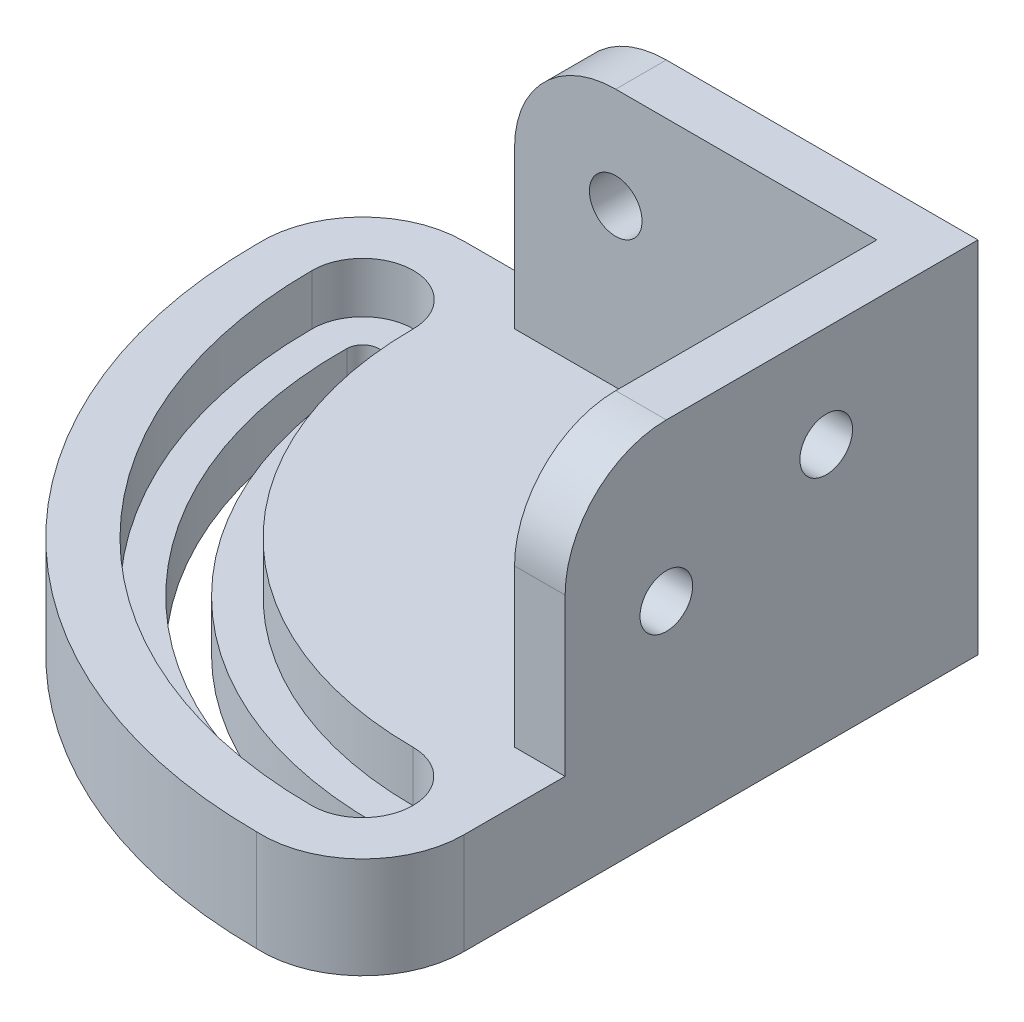
ISO-10303-21;
HEADER;
FILE_DESCRIPTION(('STEP AP214'),'2;1');
FILE_NAME('part.step','',(''),(''),'','','');
FILE_SCHEMA(('AUTOMOTIVE_DESIGN { 1 0 10303 214 1 1 1 1 }'));
ENDSEC;
DATA;
#1=APPLICATION_CONTEXT('core data for automotive mechanical design processes');
#2=APPLICATION_PROTOCOL_DEFINITION('international standard','automotive_design',2000,#1);
#3=PRODUCT_CONTEXT('',#1,'mechanical');
#4=PRODUCT('Part','Part','',(#3));
#5=PRODUCT_RELATED_PRODUCT_CATEGORY('part','',(#4));
#6=PRODUCT_DEFINITION_FORMATION('','',#4);
#7=PRODUCT_DEFINITION_CONTEXT('part definition',#1,'design');
#8=PRODUCT_DEFINITION('design','',#6,#7);
#9=PRODUCT_DEFINITION_SHAPE('','',#8);
#10=(LENGTH_UNIT() NAMED_UNIT(*) SI_UNIT(.MILLI.,.METRE.));
#11=(NAMED_UNIT(*) PLANE_ANGLE_UNIT() SI_UNIT($,.RADIAN.));
#12=(NAMED_UNIT(*) SI_UNIT($,.STERADIAN.) SOLID_ANGLE_UNIT());
#13=UNCERTAINTY_MEASURE_WITH_UNIT(LENGTH_MEASURE(1.E-05),#10,'distance_accuracy_value','');
#14=(GEOMETRIC_REPRESENTATION_CONTEXT(3) GLOBAL_UNCERTAINTY_ASSIGNED_CONTEXT((#13)) GLOBAL_UNIT_ASSIGNED_CONTEXT((#10,
#11,#12)) REPRESENTATION_CONTEXT('',''));
#15=CARTESIAN_POINT('',(0.,0.,0.));
#16=DIRECTION('',(0.,0.,1.));
#17=DIRECTION('',(1.,0.,0.));
#18=AXIS2_PLACEMENT_3D('',#15,#16,#17);
#19=CARTESIAN_POINT('',(-25.4,10.,-15.4));
#20=DIRECTION('',(0.,-1.,0.));
#21=DIRECTION('',(0.,0.,-1.));
#22=AXIS2_PLACEMENT_3D('',#19,#20,#21);
#23=CYLINDRICAL_SURFACE('',#22,1.6);
#24=DIRECTION('',(0.,-1.,0.));
#25=VECTOR('',#24,1.);
#26=CARTESIAN_POINT('',(-23.8001320190187,10.,-15.3794465713147));
#27=LINE('',#26,#25);
#28=CARTESIAN_POINT('',(-23.8001320190187,5.,-15.3794465713147));
#29=VERTEX_POINT('',#28);
#30=CARTESIAN_POINT('',(-23.8001320190187,0.,-15.3794465713147));
#31=VERTEX_POINT('',#30);
#32=EDGE_CURVE('E353',#29,#31,#27,.T.);
#33=ORIENTED_EDGE('',*,*,#32,.F.);
#34=CARTESIAN_POINT('',(-25.4,5.,-15.4));
#35=DIRECTION('',(0.,1.,0.));
#36=DIRECTION('',(0.,0.,1.));
#37=AXIS2_PLACEMENT_3D('',#34,#35,#36);
#38=CIRCLE('',#37,1.6);
#39=CARTESIAN_POINT('',(-26.9998679809813,5.,-15.4205534286851));
#40=VERTEX_POINT('',#39);
#41=EDGE_CURVE('E333',#29,#40,#38,.T.);
#42=ORIENTED_EDGE('',*,*,#41,.T.);
#43=DIRECTION('',(0.,-1.,0.));
#44=VECTOR('',#43,1.);
#45=CARTESIAN_POINT('',(-26.9998679809813,10.,-15.4205534286851));
#46=LINE('',#45,#44);
#47=CARTESIAN_POINT('',(-26.9998679809813,0.,-15.4205534286851));
#48=VERTEX_POINT('',#47);
#49=EDGE_CURVE('E362',#40,#48,#46,.T.);
#50=ORIENTED_EDGE('',*,*,#49,.T.);
#51=CARTESIAN_POINT('',(-25.4,0.,-15.4));
#52=DIRECTION('',(0.,1.,0.));
#53=DIRECTION('',(0.,0.,1.));
#54=AXIS2_PLACEMENT_3D('',#51,#52,#53);
#55=CIRCLE('',#54,1.6);
#56=EDGE_CURVE('E337',#31,#48,#55,.T.);
#57=ORIENTED_EDGE('',*,*,#56,.F.);
#58=EDGE_LOOP('',(#33,#42,#50,#57));
#59=FACE_BOUND('',#58,.T.);
#60=ADVANCED_FACE('F39',(#59),#23,.F.);
#61=CARTESIAN_POINT('',(14.8824927112459,10.,-14.8824927112459));
#62=DIRECTION('',(0.,-1.,0.));
#63=DIRECTION('',(0.,0.,-1.));
#64=AXIS2_PLACEMENT_3D('',#61,#62,#63);
#65=CYLINDRICAL_SURFACE('',#64,41.8858167699935);
#66=ORIENTED_EDGE('',*,*,#49,.F.);
#67=CARTESIAN_POINT('',(14.8824927112459,5.,-14.8824927112459));
#68=DIRECTION('',(0.,1.,0.));
#69=DIRECTION('',(0.,0.,1.));
#70=AXIS2_PLACEMENT_3D('',#67,#68,#69);
#71=CIRCLE('',#70,41.8858167699935);
#72=CARTESIAN_POINT('',(15.4205534286852,5.,26.9998679809813));
#73=VERTEX_POINT('',#72);
#74=EDGE_CURVE('E329',#40,#73,#71,.T.);
#75=ORIENTED_EDGE('',*,*,#74,.T.);
#76=DIRECTION('',(0.,-1.,0.));
#77=VECTOR('',#76,1.);
#78=CARTESIAN_POINT('',(15.4205534286852,10.,26.9998679809813));
#79=LINE('',#78,#77);
#80=CARTESIAN_POINT('',(15.4205534286852,0.,26.9998679809813));
#81=VERTEX_POINT('',#80);
#82=EDGE_CURVE('E359',#73,#81,#79,.T.);
#83=ORIENTED_EDGE('',*,*,#82,.T.);
#84=CARTESIAN_POINT('',(14.8824927112459,0.,-14.8824927112459));
#85=DIRECTION('',(0.,1.,0.));
#86=DIRECTION('',(0.,0.,1.));
#87=AXIS2_PLACEMENT_3D('',#84,#85,#86);
#88=CIRCLE('',#87,41.8858167699935);
#89=EDGE_CURVE('E341',#48,#81,#88,.T.);
#90=ORIENTED_EDGE('',*,*,#89,.F.);
#91=EDGE_LOOP('',(#66,#75,#83,#90));
#92=FACE_BOUND('',#91,.T.);
#93=ADVANCED_FACE('F464',(#92),#65,.F.);
#94=CARTESIAN_POINT('',(15.4,10.,25.4));
#95=DIRECTION('',(0.,-1.,0.));
#96=DIRECTION('',(0.,0.,-1.));
#97=AXIS2_PLACEMENT_3D('',#94,#95,#96);
#98=CYLINDRICAL_SURFACE('',#97,1.6);
#99=ORIENTED_EDGE('',*,*,#82,.F.);
#100=CARTESIAN_POINT('',(15.4,5.,25.4));
#101=DIRECTION('',(0.,1.,0.));
#102=DIRECTION('',(0.,0.,1.));
#103=AXIS2_PLACEMENT_3D('',#100,#101,#102);
#104=CIRCLE('',#103,1.6);
#105=CARTESIAN_POINT('',(15.3794465713148,5.,23.8001320190187));
#106=VERTEX_POINT('',#105);
#107=EDGE_CURVE('E316',#73,#106,#104,.T.);
#108=ORIENTED_EDGE('',*,*,#107,.T.);
#109=DIRECTION('',(0.,-1.,0.));
#110=VECTOR('',#109,1.);
#111=CARTESIAN_POINT('',(15.3794465713148,10.,23.8001320190187));
#112=LINE('',#111,#110);
#113=CARTESIAN_POINT('',(15.3794465713148,0.,23.8001320190187));
#114=VERTEX_POINT('',#113);
#115=EDGE_CURVE('E356',#106,#114,#112,.T.);
#116=ORIENTED_EDGE('',*,*,#115,.T.);
#117=CARTESIAN_POINT('',(15.4,0.,25.4));
#118=DIRECTION('',(0.,1.,0.));
#119=DIRECTION('',(0.,0.,1.));
#120=AXIS2_PLACEMENT_3D('',#117,#118,#119);
#121=CIRCLE('',#120,1.6);
#122=EDGE_CURVE('E345',#81,#114,#121,.T.);
#123=ORIENTED_EDGE('',*,*,#122,.F.);
#124=EDGE_LOOP('',(#99,#108,#116,#123));
#125=FACE_BOUND('',#124,.T.);
#126=ADVANCED_FACE('F470',(#125),#98,.F.);
#127=CARTESIAN_POINT('',(14.8824927112459,10.,-14.8824927112459));
#128=DIRECTION('',(0.,-1.,0.));
#129=DIRECTION('',(0.,0.,-1.));
#130=AXIS2_PLACEMENT_3D('',#127,#128,#129);
#131=CYLINDRICAL_SURFACE('',#130,38.6858167699935);
#132=ORIENTED_EDGE('',*,*,#115,.F.);
#133=CARTESIAN_POINT('',(14.8824927112459,5.,-14.8824927112459));
#134=DIRECTION('',(0.,1.,0.));
#135=DIRECTION('',(0.,0.,1.));
#136=AXIS2_PLACEMENT_3D('',#133,#134,#135);
#137=CIRCLE('',#136,38.6858167699935);
#138=EDGE_CURVE('E11',#106,#29,#137,.F.);
#139=ORIENTED_EDGE('',*,*,#138,.T.);
#140=ORIENTED_EDGE('',*,*,#32,.T.);
#141=CARTESIAN_POINT('',(14.8824927112459,0.,-14.8824927112459));
#142=DIRECTION('',(0.,-1.,0.));
#143=DIRECTION('',(0.,0.,1.));
#144=AXIS2_PLACEMENT_3D('',#141,#142,#143);
#145=CIRCLE('',#144,38.6858167699935);
#146=EDGE_CURVE('E349',#114,#31,#145,.T.);
#147=ORIENTED_EDGE('',*,*,#146,.F.);
#148=EDGE_LOOP('',(#132,#139,#140,#147));
#149=FACE_BOUND('',#148,.T.);
#150=ADVANCED_FACE('F478',(#149),#131,.T.);
#151=CARTESIAN_POINT('',(-25.4,10.,-15.4));
#152=DIRECTION('',(0.,-1.,0.));
#153=DIRECTION('',(0.,0.,-1.));
#154=AXIS2_PLACEMENT_3D('',#151,#152,#153);
#155=PLANE('',#154);
#156=CARTESIAN_POINT('',(15.4,10.,-15.3794465713147));
#157=DIRECTION('',(0.,1.,0.));
#158=DIRECTION('',(0.,0.,1.));
#159=AXIS2_PLACEMENT_3D('',#156,#157,#158);
#160=CIRCLE('',#159,45.8000051770025);
#161=CARTESIAN_POINT('',(-30.3999993655635,10.,-15.4025188022153));
#162=VERTEX_POINT('',#161);
#163=CARTESIAN_POINT('',(15.3769277690994,10.,30.4205527942488));
#164=VERTEX_POINT('',#163);
#165=EDGE_CURVE('E302',#162,#164,#160,.T.);
#166=ORIENTED_EDGE('',*,*,#165,.F.);
#167=CARTESIAN_POINT('',(-25.4,10.,-15.4));
#168=DIRECTION('',(0.,1.,0.));
#169=DIRECTION('',(0.,0.,1.));
#170=AXIS2_PLACEMENT_3D('',#167,#168,#169);
#171=CIRCLE('',#170,5.);
#172=CARTESIAN_POINT('',(-20.4000006344365,10.,-15.3974811977846));
#173=VERTEX_POINT('',#172);
#174=EDGE_CURVE('E281',#173,#162,#171,.T.);
#175=ORIENTED_EDGE('',*,*,#174,.F.);
#176=CARTESIAN_POINT('',(15.4,10.,-15.3794465713147));
#177=DIRECTION('',(0.,-1.,0.));
#178=DIRECTION('',(0.,0.,1.));
#179=AXIS2_PLACEMENT_3D('',#176,#177,#178);
#180=CIRCLE('',#179,35.8000051770025);
#181=CARTESIAN_POINT('',(15.3819653735301,10.,20.4205540631218));
#182=VERTEX_POINT('',#181);
#183=EDGE_CURVE('E287',#182,#173,#180,.T.);
#184=ORIENTED_EDGE('',*,*,#183,.F.);
#185=CARTESIAN_POINT('',(15.3794465713147,10.,25.4205534286853));
#186=DIRECTION('',(0.,1.,0.));
#187=DIRECTION('',(0.,0.,1.));
#188=AXIS2_PLACEMENT_3D('',#185,#186,#187);
#189=CIRCLE('',#188,5.);
#190=EDGE_CURVE('E306',#164,#182,#189,.T.);
#191=ORIENTED_EDGE('',*,*,#190,.F.);
#192=EDGE_LOOP('',(#166,#175,#184,#191));
#193=FACE_BOUND('',#192,.T.);
#194=DIRECTION('',(-1.,0.,0.));
#195=VECTOR('',#194,1.);
#196=CARTESIAN_POINT('',(-25.4,10.,-20.4));
#197=LINE('',#196,#195);
#198=CARTESIAN_POINT('',(20.4,10.,-20.4));
#199=VERTEX_POINT('',#198);
#200=CARTESIAN_POINT('',(-15.4,10.,-20.4));
#201=VERTEX_POINT('',#200);
#202=EDGE_CURVE('E222',#199,#201,#197,.T.);
#203=ORIENTED_EDGE('',*,*,#202,.T.);
#204=DIRECTION('',(0.,0.,-1.));
#205=VECTOR('',#204,1.);
#206=CARTESIAN_POINT('',(-15.4,10.,-15.4));
#207=LINE('',#206,#205);
#208=CARTESIAN_POINT('',(-15.4,10.,-25.4));
#209=VERTEX_POINT('',#208);
#210=EDGE_CURVE('E185',#201,#209,#207,.T.);
#211=ORIENTED_EDGE('',*,*,#210,.T.);
#212=DIRECTION('',(-1.,0.,0.));
#213=VECTOR('',#212,1.);
#214=CARTESIAN_POINT('',(-25.4,10.,-25.4));
#215=LINE('',#214,#213);
#216=CARTESIAN_POINT('',(-25.4,10.,-25.4));
#217=VERTEX_POINT('',#216);
#218=EDGE_CURVE('E368',#209,#217,#215,.T.);
#219=ORIENTED_EDGE('',*,*,#218,.T.);
#220=CARTESIAN_POINT('',(-25.4,10.,-15.4));
#221=DIRECTION('',(0.,1.,0.));
#222=DIRECTION('',(0.,0.,-1.));
#223=AXIS2_PLACEMENT_3D('',#220,#221,#222);
#224=CIRCLE('',#223,10.);
#225=CARTESIAN_POINT('',(-35.3866003327502,10.,-14.8824927112459));
#226=VERTEX_POINT('',#225);
#227=EDGE_CURVE('E372',#217,#226,#224,.T.);
#228=ORIENTED_EDGE('',*,*,#227,.T.);
#229=CARTESIAN_POINT('',(14.8824927112459,10.,-14.8824927112459));
#230=DIRECTION('',(0.,1.,0.));
#231=DIRECTION('',(0.,0.,-1.));
#232=AXIS2_PLACEMENT_3D('',#229,#230,#231);
#233=CIRCLE('',#232,50.2690930439961);
#234=CARTESIAN_POINT('',(14.8824927112459,10.,35.3866003327502));
#235=VERTEX_POINT('',#234);
#236=EDGE_CURVE('E375',#226,#235,#233,.T.);
#237=ORIENTED_EDGE('',*,*,#236,.T.);
#238=CARTESIAN_POINT('',(15.4,10.,25.4));
#239=DIRECTION('',(0.,1.,0.));
#240=DIRECTION('',(0.,0.,-1.));
#241=AXIS2_PLACEMENT_3D('',#238,#239,#240);
#242=CIRCLE('',#241,10.);
#243=CARTESIAN_POINT('',(25.4,10.,25.4));
#244=VERTEX_POINT('',#243);
#245=EDGE_CURVE('E378',#235,#244,#242,.T.);
#246=ORIENTED_EDGE('',*,*,#245,.T.);
#247=DIRECTION('',(0.,0.,-1.));
#248=VECTOR('',#247,1.);
#249=CARTESIAN_POINT('',(25.4,10.,25.4));
#250=LINE('',#249,#248);
#251=CARTESIAN_POINT('',(25.4,10.,15.4));
#252=VERTEX_POINT('',#251);
#253=EDGE_CURVE('E62',#244,#252,#250,.T.);
#254=ORIENTED_EDGE('',*,*,#253,.T.);
#255=DIRECTION('',(-1.,0.,0.));
#256=VECTOR('',#255,1.);
#257=CARTESIAN_POINT('',(-25.4,10.,15.4));
#258=LINE('',#257,#256);
#259=CARTESIAN_POINT('',(20.4,10.,15.4));
#260=VERTEX_POINT('',#259);
#261=EDGE_CURVE('E278',#252,#260,#258,.T.);
#262=ORIENTED_EDGE('',*,*,#261,.T.);
#263=DIRECTION('',(0.,0.,1.));
#264=VECTOR('',#263,1.);
#265=CARTESIAN_POINT('',(20.4,10.,-15.4));
#266=LINE('',#265,#264);
#267=EDGE_CURVE('E55',#199,#260,#266,.T.);
#268=ORIENTED_EDGE('',*,*,#267,.F.);
#269=EDGE_LOOP('',(#203,#211,#219,#228,#237,#246,#254,#262,#268));
#270=FACE_BOUND('',#269,.T.);
#271=ADVANCED_FACE('F437',(#193,#270),#155,.F.);
#272=CARTESIAN_POINT('',(-25.4,0.,-15.4));
#273=DIRECTION('',(0.,-1.,0.));
#274=DIRECTION('',(0.,0.,-1.));
#275=AXIS2_PLACEMENT_3D('',#272,#273,#274);
#276=PLANE('',#275);
#277=CARTESIAN_POINT('',(-25.4,0.,-15.4));
#278=DIRECTION('',(0.,1.,0.));
#279=DIRECTION('',(0.,0.,-1.));
#280=AXIS2_PLACEMENT_3D('',#277,#278,#279);
#281=CIRCLE('',#280,10.);
#282=CARTESIAN_POINT('',(-25.4,0.,-25.4));
#283=VERTEX_POINT('',#282);
#284=CARTESIAN_POINT('',(-35.3866003327502,0.,-14.8824927112459));
#285=VERTEX_POINT('',#284);
#286=EDGE_CURVE('E387',#283,#285,#281,.T.);
#287=ORIENTED_EDGE('',*,*,#286,.F.);
#288=DIRECTION('',(-1.,0.,0.));
#289=VECTOR('',#288,1.);
#290=CARTESIAN_POINT('',(-25.4,0.,-25.4));
#291=LINE('',#290,#289);
#292=CARTESIAN_POINT('',(25.4,0.,-25.4));
#293=VERTEX_POINT('',#292);
#294=EDGE_CURVE('E384',#293,#283,#291,.T.);
#295=ORIENTED_EDGE('',*,*,#294,.F.);
#296=DIRECTION('',(0.,0.,-1.));
#297=VECTOR('',#296,1.);
#298=CARTESIAN_POINT('',(25.4,0.,25.4));
#299=LINE('',#298,#297);
#300=CARTESIAN_POINT('',(25.4,0.,25.4));
#301=VERTEX_POINT('',#300);
#302=EDGE_CURVE('E365',#301,#293,#299,.T.);
#303=ORIENTED_EDGE('',*,*,#302,.F.);
#304=CARTESIAN_POINT('',(15.4,0.,25.4));
#305=DIRECTION('',(0.,1.,0.));
#306=DIRECTION('',(0.,0.,-1.));
#307=AXIS2_PLACEMENT_3D('',#304,#305,#306);
#308=CIRCLE('',#307,10.);
#309=CARTESIAN_POINT('',(14.8824927112459,0.,35.3866003327502));
#310=VERTEX_POINT('',#309);
#311=EDGE_CURVE('E369',#310,#301,#308,.T.);
#312=ORIENTED_EDGE('',*,*,#311,.F.);
#313=CARTESIAN_POINT('',(14.8824927112459,0.,-14.8824927112459));
#314=DIRECTION('',(0.,1.,0.));
#315=DIRECTION('',(0.,0.,-1.));
#316=AXIS2_PLACEMENT_3D('',#313,#314,#315);
#317=CIRCLE('',#316,50.2690930439961);
#318=EDGE_CURVE('E390',#285,#310,#317,.T.);
#319=ORIENTED_EDGE('',*,*,#318,.F.);
#320=EDGE_LOOP('',(#287,#295,#303,#312,#319));
#321=FACE_BOUND('',#320,.T.);
#322=ORIENTED_EDGE('',*,*,#146,.T.);
#323=ORIENTED_EDGE('',*,*,#56,.T.);
#324=ORIENTED_EDGE('',*,*,#89,.T.);
#325=ORIENTED_EDGE('',*,*,#122,.T.);
#326=EDGE_LOOP('',(#322,#323,#324,#325));
#327=FACE_BOUND('',#326,.T.);
#328=ADVANCED_FACE('F425',(#321,#327),#276,.T.);
#329=CARTESIAN_POINT('',(25.4,10.,25.4));
#330=DIRECTION('',(-1.,0.,0.));
#331=DIRECTION('',(0.,0.,1.));
#332=AXIS2_PLACEMENT_3D('',#329,#330,#331);
#333=PLANE('',#332);
#334=ORIENTED_EDGE('',*,*,#302,.T.);
#335=DIRECTION('',(0.,-1.,0.));
#336=VECTOR('',#335,1.);
#337=CARTESIAN_POINT('',(25.4,10.,-25.4));
#338=LINE('',#337,#336);
#339=CARTESIAN_POINT('',(25.4,35.5092988095708,-25.4));
#340=VERTEX_POINT('',#339);
#341=EDGE_CURVE('E48',#340,#293,#338,.T.);
#342=ORIENTED_EDGE('',*,*,#341,.F.);
#343=DIRECTION('',(0.,0.,1.));
#344=VECTOR('',#343,1.);
#345=CARTESIAN_POINT('',(25.4,35.5092988095708,5.4));
#346=LINE('',#345,#344);
#347=CARTESIAN_POINT('',(25.4,35.5092988095708,5.4));
#348=VERTEX_POINT('',#347);
#349=EDGE_CURVE('E240',#340,#348,#346,.T.);
#350=ORIENTED_EDGE('',*,*,#349,.T.);
#351=CARTESIAN_POINT('',(25.4,25.5092988095708,5.4));
#352=DIRECTION('',(1.,0.,0.));
#353=DIRECTION('',(0.,0.,-1.));
#354=AXIS2_PLACEMENT_3D('',#351,#352,#353);
#355=CIRCLE('',#354,10.);
#356=CARTESIAN_POINT('',(25.4,25.5092988095708,15.4));
#357=VERTEX_POINT('',#356);
#358=EDGE_CURVE('E259',#348,#357,#355,.T.);
#359=ORIENTED_EDGE('',*,*,#358,.T.);
#360=DIRECTION('',(0.,-1.,0.));
#361=VECTOR('',#360,1.);
#362=CARTESIAN_POINT('',(25.4,25.5092988095708,15.4));
#363=LINE('',#362,#361);
#364=EDGE_CURVE('E248',#357,#252,#363,.T.);
#365=ORIENTED_EDGE('',*,*,#364,.T.);
#366=ORIENTED_EDGE('',*,*,#253,.F.);
#367=DIRECTION('',(0.,-1.,0.));
#368=VECTOR('',#367,1.);
#369=CARTESIAN_POINT('',(25.4,10.,25.4));
#370=LINE('',#369,#368);
#371=EDGE_CURVE('E381',#244,#301,#370,.T.);
#372=ORIENTED_EDGE('',*,*,#371,.T.);
#373=EDGE_LOOP('',(#334,#342,#350,#359,#365,#366,#372));
#374=FACE_BOUND('',#373,.T.);
#375=CARTESIAN_POINT('',(25.4,25.5092988095708,-10.4));
#376=DIRECTION('',(1.,0.,0.));
#377=DIRECTION('',(0.,0.,-1.));
#378=AXIS2_PLACEMENT_3D('',#375,#376,#377);
#379=CIRCLE('',#378,2.6);
#380=CARTESIAN_POINT('',(25.4,25.5092988095708,-13.));
#381=VERTEX_POINT('',#380);
#382=EDGE_CURVE('E232',#381,#381,#379,.T.);
#383=ORIENTED_EDGE('',*,*,#382,.F.);
#384=EDGE_LOOP('',(#383));
#385=FACE_BOUND('',#384,.T.);
#386=CARTESIAN_POINT('',(25.4,20.,5.4));
#387=DIRECTION('',(1.,0.,0.));
#388=DIRECTION('',(0.,0.,-1.));
#389=AXIS2_PLACEMENT_3D('',#386,#387,#388);
#390=CIRCLE('',#389,2.6);
#391=CARTESIAN_POINT('',(25.4,20.,2.8));
#392=VERTEX_POINT('',#391);
#393=EDGE_CURVE('E227',#392,#392,#390,.T.);
#394=ORIENTED_EDGE('',*,*,#393,.F.);
#395=EDGE_LOOP('',(#394));
#396=FACE_BOUND('',#395,.T.);
#397=ADVANCED_FACE('F41',(#374,#385,#396),#333,.F.);
#398=CARTESIAN_POINT('',(-25.4,10.,-25.4));
#399=DIRECTION('',(0.,0.,1.));
#400=DIRECTION('',(1.,0.,0.));
#401=AXIS2_PLACEMENT_3D('',#398,#399,#400);
#402=PLANE('',#401);
#403=ORIENTED_EDGE('',*,*,#218,.F.);
#404=DIRECTION('',(0.,1.,0.));
#405=VECTOR('',#404,1.);
#406=CARTESIAN_POINT('',(-15.4,0.,-25.4));
#407=LINE('',#406,#405);
#408=CARTESIAN_POINT('',(-15.4,25.5092988095707,-25.4));
#409=VERTEX_POINT('',#408);
#410=EDGE_CURVE('E211',#209,#409,#407,.T.);
#411=ORIENTED_EDGE('',*,*,#410,.T.);
#412=CARTESIAN_POINT('',(-5.4,25.5092988095708,-25.4));
#413=DIRECTION('',(0.,0.,-1.));
#414=DIRECTION('',(1.,0.,0.));
#415=AXIS2_PLACEMENT_3D('',#412,#413,#414);
#416=CIRCLE('',#415,10.);
#417=CARTESIAN_POINT('',(-5.39999999999993,35.5092988095708,-25.4));
#418=VERTEX_POINT('',#417);
#419=EDGE_CURVE('E191',#409,#418,#416,.T.);
#420=ORIENTED_EDGE('',*,*,#419,.T.);
#421=DIRECTION('',(1.,0.,0.));
#422=VECTOR('',#421,1.);
#423=CARTESIAN_POINT('',(20.4,35.5092988095708,-25.4));
#424=LINE('',#423,#422);
#425=EDGE_CURVE('E256',#418,#340,#424,.T.);
#426=ORIENTED_EDGE('',*,*,#425,.T.);
#427=ORIENTED_EDGE('',*,*,#341,.T.);
#428=ORIENTED_EDGE('',*,*,#294,.T.);
#429=DIRECTION('',(0.,-1.,0.));
#430=VECTOR('',#429,1.);
#431=CARTESIAN_POINT('',(-25.4,10.,-25.4));
#432=LINE('',#431,#430);
#433=EDGE_CURVE('E406',#217,#283,#432,.T.);
#434=ORIENTED_EDGE('',*,*,#433,.F.);
#435=EDGE_LOOP('',(#403,#411,#420,#426,#427,#428,#434));
#436=FACE_BOUND('',#435,.T.);
#437=CARTESIAN_POINT('',(10.4,20.,-25.4));
#438=DIRECTION('',(0.,0.,-1.));
#439=DIRECTION('',(-1.,0.,0.));
#440=AXIS2_PLACEMENT_3D('',#437,#438,#439);
#441=CIRCLE('',#440,2.6);
#442=CARTESIAN_POINT('',(7.79999999999999,20.,-25.4));
#443=VERTEX_POINT('',#442);
#444=EDGE_CURVE('E709',#443,#443,#441,.T.);
#445=ORIENTED_EDGE('',*,*,#444,.F.);
#446=EDGE_LOOP('',(#445));
#447=FACE_BOUND('',#446,.T.);
#448=CARTESIAN_POINT('',(-5.4,25.5092988095708,-25.4));
#449=DIRECTION('',(0.,0.,-1.));
#450=DIRECTION('',(-1.,0.,0.));
#451=AXIS2_PLACEMENT_3D('',#448,#449,#450);
#452=CIRCLE('',#451,2.6);
#453=CARTESIAN_POINT('',(-8.,25.5092988095708,-25.4));
#454=VERTEX_POINT('',#453);
#455=EDGE_CURVE('E713',#454,#454,#452,.T.);
#456=ORIENTED_EDGE('',*,*,#455,.F.);
#457=EDGE_LOOP('',(#456));
#458=FACE_BOUND('',#457,.T.);
#459=ADVANCED_FACE('F413',(#436,#447,#458),#402,.F.);
#460=CARTESIAN_POINT('',(-25.4,10.,-15.4));
#461=DIRECTION('',(0.,-1.,0.));
#462=DIRECTION('',(0.,0.,-1.));
#463=AXIS2_PLACEMENT_3D('',#460,#461,#462);
#464=CYLINDRICAL_SURFACE('',#463,10.);
#465=ORIENTED_EDGE('',*,*,#286,.T.);
#466=DIRECTION('',(0.,-1.,0.));
#467=VECTOR('',#466,1.);
#468=CARTESIAN_POINT('',(-35.3866003327502,10.,-14.8824927112459));
#469=LINE('',#468,#467);
#470=EDGE_CURVE('E402',#226,#285,#469,.T.);
#471=ORIENTED_EDGE('',*,*,#470,.F.);
#472=ORIENTED_EDGE('',*,*,#227,.F.);
#473=ORIENTED_EDGE('',*,*,#433,.T.);
#474=EDGE_LOOP('',(#465,#471,#472,#473));
#475=FACE_BOUND('',#474,.T.);
#476=ADVANCED_FACE('F430',(#475),#464,.T.);
#477=CARTESIAN_POINT('',(14.8824927112459,10.,-14.8824927112459));
#478=DIRECTION('',(0.,-1.,0.));
#479=DIRECTION('',(0.,0.,-1.));
#480=AXIS2_PLACEMENT_3D('',#477,#478,#479);
#481=CYLINDRICAL_SURFACE('',#480,50.2690930439961);
#482=ORIENTED_EDGE('',*,*,#318,.T.);
#483=DIRECTION('',(0.,-1.,0.));
#484=VECTOR('',#483,1.);
#485=CARTESIAN_POINT('',(14.8824927112459,10.,35.3866003327502));
#486=LINE('',#485,#484);
#487=EDGE_CURVE('E398',#235,#310,#486,.T.);
#488=ORIENTED_EDGE('',*,*,#487,.F.);
#489=ORIENTED_EDGE('',*,*,#236,.F.);
#490=ORIENTED_EDGE('',*,*,#470,.T.);
#491=EDGE_LOOP('',(#482,#488,#489,#490));
#492=FACE_BOUND('',#491,.T.);
#493=ADVANCED_FACE('F434',(#492),#481,.T.);
#494=CARTESIAN_POINT('',(15.4,10.,25.4));
#495=DIRECTION('',(0.,-1.,0.));
#496=DIRECTION('',(0.,0.,-1.));
#497=AXIS2_PLACEMENT_3D('',#494,#495,#496);
#498=CYLINDRICAL_SURFACE('',#497,10.);
#499=ORIENTED_EDGE('',*,*,#311,.T.);
#500=ORIENTED_EDGE('',*,*,#371,.F.);
#501=ORIENTED_EDGE('',*,*,#245,.F.);
#502=ORIENTED_EDGE('',*,*,#487,.T.);
#503=EDGE_LOOP('',(#499,#500,#501,#502));
#504=FACE_BOUND('',#503,.T.);
#505=ADVANCED_FACE('F482',(#504),#498,.T.);
#506=CARTESIAN_POINT('',(-25.4,5.,-15.4));
#507=DIRECTION('',(0.,1.,0.));
#508=DIRECTION('',(0.,0.,1.));
#509=AXIS2_PLACEMENT_3D('',#506,#507,#508);
#510=CYLINDRICAL_SURFACE('',#509,5.);
#511=ORIENTED_EDGE('',*,*,#174,.T.);
#512=DIRECTION('',(0.,1.,0.));
#513=VECTOR('',#512,1.);
#514=CARTESIAN_POINT('',(-30.3999993655635,5.,-15.4025188022153));
#515=LINE('',#514,#513);
#516=CARTESIAN_POINT('',(-30.3999993655635,5.,-15.4025188022153));
#517=VERTEX_POINT('',#516);
#518=EDGE_CURVE('E299',#517,#162,#515,.T.);
#519=ORIENTED_EDGE('',*,*,#518,.F.);
#520=CARTESIAN_POINT('',(-25.4,5.,-15.4));
#521=DIRECTION('',(0.,1.,0.));
#522=DIRECTION('',(0.,0.,1.));
#523=AXIS2_PLACEMENT_3D('',#520,#521,#522);
#524=CIRCLE('',#523,5.);
#525=CARTESIAN_POINT('',(-20.4000006344365,5.,-15.3974811977846));
#526=VERTEX_POINT('',#525);
#527=EDGE_CURVE('E282',#526,#517,#524,.T.);
#528=ORIENTED_EDGE('',*,*,#527,.F.);
#529=DIRECTION('',(0.,1.,0.));
#530=VECTOR('',#529,1.);
#531=CARTESIAN_POINT('',(-20.4000006344365,5.,-15.3974811977846));
#532=LINE('',#531,#530);
#533=EDGE_CURVE('E313',#526,#173,#532,.T.);
#534=ORIENTED_EDGE('',*,*,#533,.T.);
#535=EDGE_LOOP('',(#511,#519,#528,#534));
#536=FACE_BOUND('',#535,.T.);
#537=ADVANCED_FACE('F485',(#536),#510,.F.);
#538=CARTESIAN_POINT('',(15.4,5.,-15.3794465713147));
#539=DIRECTION('',(0.,1.,0.));
#540=DIRECTION('',(0.,0.,1.));
#541=AXIS2_PLACEMENT_3D('',#538,#539,#540);
#542=CYLINDRICAL_SURFACE('',#541,35.8000051770025);
#543=ORIENTED_EDGE('',*,*,#183,.T.);
#544=ORIENTED_EDGE('',*,*,#533,.F.);
#545=CARTESIAN_POINT('',(15.4,5.,-15.3794465713147));
#546=DIRECTION('',(0.,-1.,0.));
#547=DIRECTION('',(0.,0.,1.));
#548=AXIS2_PLACEMENT_3D('',#545,#546,#547);
#549=CIRCLE('',#548,35.8000051770025);
#550=CARTESIAN_POINT('',(15.3819653735301,5.,20.4205540631218));
#551=VERTEX_POINT('',#550);
#552=EDGE_CURVE('E295',#551,#526,#549,.T.);
#553=ORIENTED_EDGE('',*,*,#552,.F.);
#554=DIRECTION('',(0.,1.,0.));
#555=VECTOR('',#554,1.);
#556=CARTESIAN_POINT('',(15.3819653735301,5.,20.4205540631218));
#557=LINE('',#556,#555);
#558=EDGE_CURVE('E317',#551,#182,#557,.T.);
#559=ORIENTED_EDGE('',*,*,#558,.T.);
#560=EDGE_LOOP('',(#543,#544,#553,#559));
#561=FACE_BOUND('',#560,.T.);
#562=ADVANCED_FACE('F588',(#561),#542,.T.);
#563=CARTESIAN_POINT('',(15.3794465713147,5.,25.4205534286853));
#564=DIRECTION('',(0.,1.,0.));
#565=DIRECTION('',(0.,0.,1.));
#566=AXIS2_PLACEMENT_3D('',#563,#564,#565);
#567=CYLINDRICAL_SURFACE('',#566,5.);
#568=ORIENTED_EDGE('',*,*,#190,.T.);
#569=ORIENTED_EDGE('',*,*,#558,.F.);
#570=CARTESIAN_POINT('',(15.3794465713147,5.,25.4205534286853));
#571=DIRECTION('',(0.,1.,0.));
#572=DIRECTION('',(0.,0.,1.));
#573=AXIS2_PLACEMENT_3D('',#570,#571,#572);
#574=CIRCLE('',#573,5.);
#575=CARTESIAN_POINT('',(15.3769277690994,5.,30.4205527942488));
#576=VERTEX_POINT('',#575);
#577=EDGE_CURVE('E291',#576,#551,#574,.T.);
#578=ORIENTED_EDGE('',*,*,#577,.F.);
#579=DIRECTION('',(0.,1.,0.));
#580=VECTOR('',#579,1.);
#581=CARTESIAN_POINT('',(15.3769277690994,5.,30.4205527942488));
#582=LINE('',#581,#580);
#583=EDGE_CURVE('E320',#576,#164,#582,.T.);
#584=ORIENTED_EDGE('',*,*,#583,.T.);
#585=EDGE_LOOP('',(#568,#569,#578,#584));
#586=FACE_BOUND('',#585,.T.);
#587=ADVANCED_FACE('F579',(#586),#567,.F.);
#588=CARTESIAN_POINT('',(15.4,5.,-15.3794465713147));
#589=DIRECTION('',(0.,1.,0.));
#590=DIRECTION('',(0.,0.,1.));
#591=AXIS2_PLACEMENT_3D('',#588,#589,#590);
#592=CYLINDRICAL_SURFACE('',#591,45.8000051770025);
#593=ORIENTED_EDGE('',*,*,#165,.T.);
#594=ORIENTED_EDGE('',*,*,#583,.F.);
#595=CARTESIAN_POINT('',(15.4,5.,-15.3794465713147));
#596=DIRECTION('',(0.,1.,0.));
#597=DIRECTION('',(0.,0.,1.));
#598=AXIS2_PLACEMENT_3D('',#595,#596,#597);
#599=CIRCLE('',#598,45.8000051770025);
#600=EDGE_CURVE('E286',#517,#576,#599,.T.);
#601=ORIENTED_EDGE('',*,*,#600,.F.);
#602=ORIENTED_EDGE('',*,*,#518,.T.);
#603=EDGE_LOOP('',(#593,#594,#601,#602));
#604=FACE_BOUND('',#603,.T.);
#605=ADVANCED_FACE('F459',(#604),#592,.F.);
#606=CARTESIAN_POINT('',(-5.00000000000001,5.,-15.3897232856574));
#607=DIRECTION('',(0.,1.,0.));
#608=DIRECTION('',(0.,0.,1.));
#609=AXIS2_PLACEMENT_3D('',#606,#607,#608);
#610=PLANE('',#609);
#611=ORIENTED_EDGE('',*,*,#138,.F.);
#612=ORIENTED_EDGE('',*,*,#107,.F.);
#613=ORIENTED_EDGE('',*,*,#74,.F.);
#614=ORIENTED_EDGE('',*,*,#41,.F.);
#615=EDGE_LOOP('',(#611,#612,#613,#614));
#616=FACE_BOUND('',#615,.T.);
#617=ORIENTED_EDGE('',*,*,#527,.T.);
#618=ORIENTED_EDGE('',*,*,#600,.T.);
#619=ORIENTED_EDGE('',*,*,#577,.T.);
#620=ORIENTED_EDGE('',*,*,#552,.T.);
#621=EDGE_LOOP('',(#617,#618,#619,#620));
#622=FACE_BOUND('',#621,.T.);
#623=ADVANCED_FACE('F451',(#616,#622),#610,.T.);
#624=CARTESIAN_POINT('',(20.4,25.5092988095708,15.4));
#625=DIRECTION('',(0.,0.,1.));
#626=DIRECTION('',(1.,0.,0.));
#627=AXIS2_PLACEMENT_3D('',#624,#625,#626);
#628=PLANE('',#627);
#629=ORIENTED_EDGE('',*,*,#261,.F.);
#630=ORIENTED_EDGE('',*,*,#364,.F.);
#631=DIRECTION('',(1.,0.,0.));
#632=VECTOR('',#631,1.);
#633=CARTESIAN_POINT('',(20.4,25.5092988095708,15.4));
#634=LINE('',#633,#632);
#635=CARTESIAN_POINT('',(20.4,25.5092988095708,15.4));
#636=VERTEX_POINT('',#635);
#637=EDGE_CURVE('E266',#636,#357,#634,.T.);
#638=ORIENTED_EDGE('',*,*,#637,.F.);
#639=DIRECTION('',(0.,-1.,0.));
#640=VECTOR('',#639,1.);
#641=CARTESIAN_POINT('',(20.4,25.5092988095708,15.4));
#642=LINE('',#641,#640);
#643=EDGE_CURVE('E252',#636,#260,#642,.T.);
#644=ORIENTED_EDGE('',*,*,#643,.T.);
#645=EDGE_LOOP('',(#629,#630,#638,#644));
#646=FACE_BOUND('',#645,.T.);
#647=ADVANCED_FACE('F449',(#646),#628,.T.);
#648=CARTESIAN_POINT('',(20.4,25.5092988095708,5.4));
#649=DIRECTION('',(1.,0.,0.));
#650=DIRECTION('',(0.,0.,-1.));
#651=AXIS2_PLACEMENT_3D('',#648,#649,#650);
#652=PLANE('',#651);
#653=CARTESIAN_POINT('',(20.4,20.,5.4));
#654=DIRECTION('',(1.,0.,0.));
#655=DIRECTION('',(0.,0.,-1.));
#656=AXIS2_PLACEMENT_3D('',#653,#654,#655);
#657=CIRCLE('',#656,2.6);
#658=CARTESIAN_POINT('',(20.4,20.,2.8));
#659=VERTEX_POINT('',#658);
#660=EDGE_CURVE('E228',#659,#659,#657,.T.);
#661=ORIENTED_EDGE('',*,*,#660,.T.);
#662=EDGE_LOOP('',(#661));
#663=FACE_BOUND('',#662,.T.);
#664=CARTESIAN_POINT('',(20.4,25.5092988095708,-10.4));
#665=DIRECTION('',(1.,0.,0.));
#666=DIRECTION('',(0.,0.,-1.));
#667=AXIS2_PLACEMENT_3D('',#664,#665,#666);
#668=CIRCLE('',#667,2.6);
#669=CARTESIAN_POINT('',(20.4,25.5092988095708,-13.));
#670=VERTEX_POINT('',#669);
#671=EDGE_CURVE('E236',#670,#670,#668,.T.);
#672=ORIENTED_EDGE('',*,*,#671,.T.);
#673=EDGE_LOOP('',(#672));
#674=FACE_BOUND('',#673,.T.);
#675=DIRECTION('',(0.,0.,1.));
#676=VECTOR('',#675,1.);
#677=CARTESIAN_POINT('',(20.4,35.5092988095708,5.4));
#678=LINE('',#677,#676);
#679=CARTESIAN_POINT('',(20.4,35.5092988095708,-20.4));
#680=VERTEX_POINT('',#679);
#681=CARTESIAN_POINT('',(20.4,35.5092988095708,5.4));
#682=VERTEX_POINT('',#681);
#683=EDGE_CURVE('E244',#680,#682,#678,.T.);
#684=ORIENTED_EDGE('',*,*,#683,.F.);
#685=DIRECTION('',(0.,-1.,0.));
#686=VECTOR('',#685,1.);
#687=CARTESIAN_POINT('',(20.4,25.5092988095708,-20.4));
#688=LINE('',#687,#686);
#689=EDGE_CURVE('E218',#680,#199,#688,.T.);
#690=ORIENTED_EDGE('',*,*,#689,.T.);
#691=ORIENTED_EDGE('',*,*,#267,.T.);
#692=ORIENTED_EDGE('',*,*,#643,.F.);
#693=CARTESIAN_POINT('',(20.4,25.5092988095708,5.4));
#694=DIRECTION('',(1.,0.,0.));
#695=DIRECTION('',(0.,0.,-1.));
#696=AXIS2_PLACEMENT_3D('',#693,#694,#695);
#697=CIRCLE('',#696,10.);
#698=EDGE_CURVE('E247',#682,#636,#697,.T.);
#699=ORIENTED_EDGE('',*,*,#698,.F.);
#700=EDGE_LOOP('',(#684,#690,#691,#692,#699));
#701=FACE_BOUND('',#700,.T.);
#702=ADVANCED_FACE('F439',(#663,#674,#701),#652,.F.);
#703=CARTESIAN_POINT('',(20.4,25.5092988095708,5.4));
#704=DIRECTION('',(1.,0.,0.));
#705=DIRECTION('',(0.,0.,-1.));
#706=AXIS2_PLACEMENT_3D('',#703,#704,#705);
#707=CYLINDRICAL_SURFACE('',#706,10.);
#708=ORIENTED_EDGE('',*,*,#358,.F.);
#709=DIRECTION('',(1.,0.,0.));
#710=VECTOR('',#709,1.);
#711=CARTESIAN_POINT('',(20.4,35.5092988095708,5.4));
#712=LINE('',#711,#710);
#713=EDGE_CURVE('E269',#682,#348,#712,.T.);
#714=ORIENTED_EDGE('',*,*,#713,.F.);
#715=ORIENTED_EDGE('',*,*,#698,.T.);
#716=ORIENTED_EDGE('',*,*,#637,.T.);
#717=EDGE_LOOP('',(#708,#714,#715,#716));
#718=FACE_BOUND('',#717,.T.);
#719=ADVANCED_FACE('F446',(#718),#707,.T.);
#720=CARTESIAN_POINT('',(20.4,35.5092988095708,5.4));
#721=DIRECTION('',(0.,1.,0.));
#722=DIRECTION('',(0.,0.,1.));
#723=AXIS2_PLACEMENT_3D('',#720,#721,#722);
#724=PLANE('',#723);
#725=ORIENTED_EDGE('',*,*,#713,.T.);
#726=ORIENTED_EDGE('',*,*,#349,.F.);
#727=ORIENTED_EDGE('',*,*,#425,.F.);
#728=DIRECTION('',(0.,0.,-1.));
#729=VECTOR('',#728,1.);
#730=CARTESIAN_POINT('',(-5.39999999999993,35.5092988095708,-20.4));
#731=LINE('',#730,#729);
#732=CARTESIAN_POINT('',(-5.39999999999993,35.5092988095708,-20.4));
#733=VERTEX_POINT('',#732);
#734=EDGE_CURVE('E199',#733,#418,#731,.T.);
#735=ORIENTED_EDGE('',*,*,#734,.F.);
#736=DIRECTION('',(1.,0.,0.));
#737=VECTOR('',#736,1.);
#738=CARTESIAN_POINT('',(-5.39999999999993,35.5092988095708,-20.4));
#739=LINE('',#738,#737);
#740=EDGE_CURVE('E200',#733,#680,#739,.T.);
#741=ORIENTED_EDGE('',*,*,#740,.T.);
#742=ORIENTED_EDGE('',*,*,#683,.T.);
#743=EDGE_LOOP('',(#725,#726,#727,#735,#741,#742));
#744=FACE_BOUND('',#743,.T.);
#745=ADVANCED_FACE('F443',(#744),#724,.T.);
#746=CARTESIAN_POINT('',(20.4,25.5092988095708,-10.4));
#747=DIRECTION('',(1.,0.,0.));
#748=DIRECTION('',(0.,0.,-1.));
#749=AXIS2_PLACEMENT_3D('',#746,#747,#748);
#750=CYLINDRICAL_SURFACE('',#749,2.6);
#751=ORIENTED_EDGE('',*,*,#671,.F.);
#752=EDGE_LOOP('',(#751));
#753=FACE_BOUND('',#752,.T.);
#754=ORIENTED_EDGE('',*,*,#382,.T.);
#755=EDGE_LOOP('',(#754));
#756=FACE_BOUND('',#755,.T.);
#757=ADVANCED_FACE('F611',(#753,#756),#750,.F.);
#758=CARTESIAN_POINT('',(20.4,20.,5.4));
#759=DIRECTION('',(1.,0.,0.));
#760=DIRECTION('',(0.,0.,-1.));
#761=AXIS2_PLACEMENT_3D('',#758,#759,#760);
#762=CYLINDRICAL_SURFACE('',#761,2.6);
#763=ORIENTED_EDGE('',*,*,#660,.F.);
#764=EDGE_LOOP('',(#763));
#765=FACE_BOUND('',#764,.T.);
#766=ORIENTED_EDGE('',*,*,#393,.T.);
#767=EDGE_LOOP('',(#766));
#768=FACE_BOUND('',#767,.T.);
#769=ADVANCED_FACE('F628',(#765,#768),#762,.F.);
#770=CARTESIAN_POINT('',(-15.4,0.,-20.4));
#771=DIRECTION('',(-1.,0.,0.));
#772=DIRECTION('',(0.,-1.,0.));
#773=AXIS2_PLACEMENT_3D('',#770,#771,#772);
#774=PLANE('',#773);
#775=ORIENTED_EDGE('',*,*,#210,.F.);
#776=DIRECTION('',(0.,1.,0.));
#777=VECTOR('',#776,1.);
#778=CARTESIAN_POINT('',(-15.4,0.,-20.4));
#779=LINE('',#778,#777);
#780=CARTESIAN_POINT('',(-15.4,25.5092988095707,-20.4));
#781=VERTEX_POINT('',#780);
#782=EDGE_CURVE('E179',#201,#781,#779,.T.);
#783=ORIENTED_EDGE('',*,*,#782,.T.);
#784=DIRECTION('',(0.,0.,-1.));
#785=VECTOR('',#784,1.);
#786=CARTESIAN_POINT('',(-15.4,25.5092988095707,-20.4));
#787=LINE('',#786,#785);
#788=EDGE_CURVE('E182',#781,#409,#787,.T.);
#789=ORIENTED_EDGE('',*,*,#788,.T.);
#790=ORIENTED_EDGE('',*,*,#410,.F.);
#791=EDGE_LOOP('',(#775,#783,#789,#790));
#792=FACE_BOUND('',#791,.T.);
#793=ADVANCED_FACE('F181',(#792),#774,.T.);
#794=CARTESIAN_POINT('',(-5.4,25.5092988095708,-20.4));
#795=DIRECTION('',(0.,0.,1.));
#796=DIRECTION('',(1.,0.,0.));
#797=AXIS2_PLACEMENT_3D('',#794,#795,#796);
#798=PLANE('',#797);
#799=CARTESIAN_POINT('',(-5.4,25.5092988095708,-20.4));
#800=DIRECTION('',(0.,0.,-1.));
#801=DIRECTION('',(-1.,0.,0.));
#802=AXIS2_PLACEMENT_3D('',#799,#800,#801);
#803=CIRCLE('',#802,2.6);
#804=CARTESIAN_POINT('',(-8.,25.5092988095708,-20.4));
#805=VERTEX_POINT('',#804);
#806=EDGE_CURVE('E214',#805,#805,#803,.T.);
#807=ORIENTED_EDGE('',*,*,#806,.T.);
#808=EDGE_LOOP('',(#807));
#809=FACE_BOUND('',#808,.T.);
#810=CARTESIAN_POINT('',(10.4,20.,-20.4));
#811=DIRECTION('',(0.,0.,-1.));
#812=DIRECTION('',(-1.,0.,0.));
#813=AXIS2_PLACEMENT_3D('',#810,#811,#812);
#814=CIRCLE('',#813,2.6);
#815=CARTESIAN_POINT('',(7.79999999999999,20.,-20.4));
#816=VERTEX_POINT('',#815);
#817=EDGE_CURVE('E706',#816,#816,#814,.T.);
#818=ORIENTED_EDGE('',*,*,#817,.T.);
#819=EDGE_LOOP('',(#818));
#820=FACE_BOUND('',#819,.T.);
#821=ORIENTED_EDGE('',*,*,#202,.F.);
#822=ORIENTED_EDGE('',*,*,#689,.F.);
#823=ORIENTED_EDGE('',*,*,#740,.F.);
#824=CARTESIAN_POINT('',(-5.4,25.5092988095708,-20.4));
#825=DIRECTION('',(0.,0.,-1.));
#826=DIRECTION('',(1.,0.,0.));
#827=AXIS2_PLACEMENT_3D('',#824,#825,#826);
#828=CIRCLE('',#827,10.);
#829=EDGE_CURVE('E190',#781,#733,#828,.T.);
#830=ORIENTED_EDGE('',*,*,#829,.F.);
#831=ORIENTED_EDGE('',*,*,#782,.F.);
#832=EDGE_LOOP('',(#821,#822,#823,#830,#831));
#833=FACE_BOUND('',#832,.T.);
#834=ADVANCED_FACE('F203',(#809,#820,#833),#798,.T.);
#835=CARTESIAN_POINT('',(-5.4,25.5092988095708,-20.4));
#836=DIRECTION('',(0.,0.,-1.));
#837=DIRECTION('',(-1.,0.,0.));
#838=AXIS2_PLACEMENT_3D('',#835,#836,#837);
#839=CYLINDRICAL_SURFACE('',#838,10.);
#840=ORIENTED_EDGE('',*,*,#419,.F.);
#841=ORIENTED_EDGE('',*,*,#788,.F.);
#842=ORIENTED_EDGE('',*,*,#829,.T.);
#843=ORIENTED_EDGE('',*,*,#734,.T.);
#844=EDGE_LOOP('',(#840,#841,#842,#843));
#845=FACE_BOUND('',#844,.T.);
#846=ADVANCED_FACE('F195',(#845),#839,.T.);
#847=CARTESIAN_POINT('',(-5.4,25.5092988095708,-20.4));
#848=DIRECTION('',(0.,0.,-1.));
#849=DIRECTION('',(-1.,0.,0.));
#850=AXIS2_PLACEMENT_3D('',#847,#848,#849);
#851=CYLINDRICAL_SURFACE('',#850,2.6);
#852=ORIENTED_EDGE('',*,*,#806,.F.);
#853=EDGE_LOOP('',(#852));
#854=FACE_BOUND('',#853,.T.);
#855=ORIENTED_EDGE('',*,*,#455,.T.);
#856=EDGE_LOOP('',(#855));
#857=FACE_BOUND('',#856,.T.);
#858=ADVANCED_FACE('F654',(#854,#857),#851,.F.);
#859=CARTESIAN_POINT('',(10.4,20.,-20.4));
#860=DIRECTION('',(0.,0.,-1.));
#861=DIRECTION('',(-1.,0.,0.));
#862=AXIS2_PLACEMENT_3D('',#859,#860,#861);
#863=CYLINDRICAL_SURFACE('',#862,2.6);
#864=ORIENTED_EDGE('',*,*,#817,.F.);
#865=EDGE_LOOP('',(#864));
#866=FACE_BOUND('',#865,.T.);
#867=ORIENTED_EDGE('',*,*,#444,.T.);
#868=EDGE_LOOP('',(#867));
#869=FACE_BOUND('',#868,.T.);
#870=ADVANCED_FACE('F661',(#866,#869),#863,.F.);
#871=CLOSED_SHELL('',(#60,#93,#126,#150,#271,#328,#397,#459,#476,#493,#505,#537,#562,#587,#605,
#623,#647,#702,#719,#745,#757,#769,#793,#834,#846,#858,#870));
#872=MANIFOLD_SOLID_BREP('B2',#871);
#873=ADVANCED_BREP_SHAPE_REPRESENTATION('',(#18,#872),#14);
#874=SHAPE_DEFINITION_REPRESENTATION(#9,#873);
ENDSEC;
END-ISO-10303-21;
